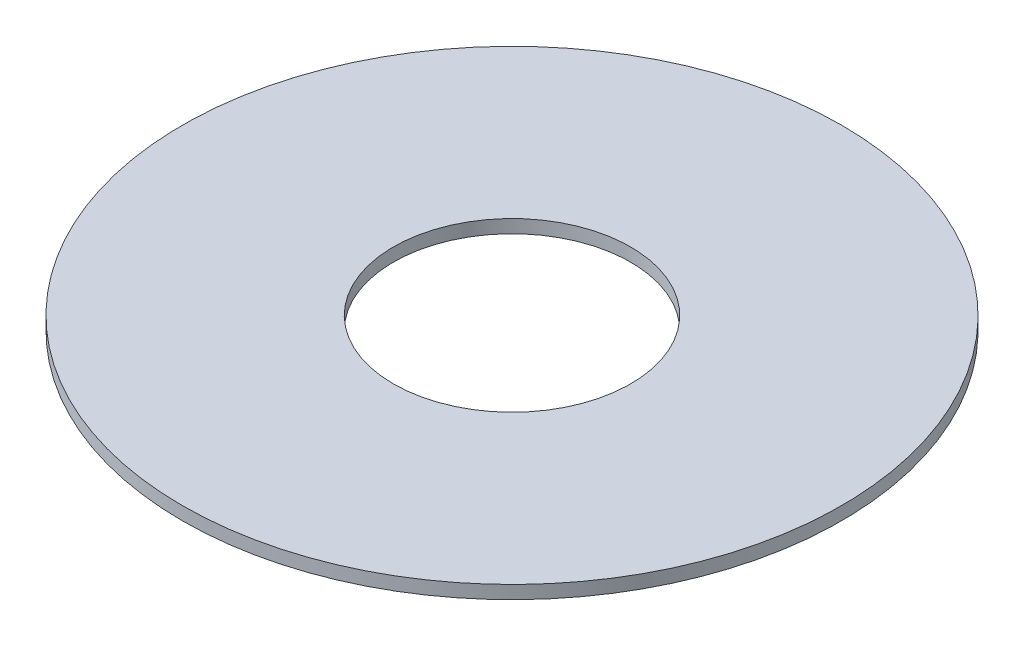
ISO-10303-21;
HEADER;
FILE_DESCRIPTION(('STEP AP214'),'2;1');
FILE_NAME('part.step','',(''),(''),'','','');
FILE_SCHEMA(('AUTOMOTIVE_DESIGN { 1 0 10303 214 1 1 1 1 }'));
ENDSEC;
DATA;
#1=APPLICATION_CONTEXT('core data for automotive mechanical design processes');
#2=APPLICATION_PROTOCOL_DEFINITION('international standard','automotive_design',2000,#1);
#3=PRODUCT_CONTEXT('',#1,'mechanical');
#4=PRODUCT('Part','Part','',(#3));
#5=PRODUCT_RELATED_PRODUCT_CATEGORY('part','',(#4));
#6=PRODUCT_DEFINITION_FORMATION('','',#4);
#7=PRODUCT_DEFINITION_CONTEXT('part definition',#1,'design');
#8=PRODUCT_DEFINITION('design','',#6,#7);
#9=PRODUCT_DEFINITION_SHAPE('','',#8);
#10=(LENGTH_UNIT() NAMED_UNIT(*) SI_UNIT(.MILLI.,.METRE.));
#11=(NAMED_UNIT(*) PLANE_ANGLE_UNIT() SI_UNIT($,.RADIAN.));
#12=(NAMED_UNIT(*) SI_UNIT($,.STERADIAN.) SOLID_ANGLE_UNIT());
#13=UNCERTAINTY_MEASURE_WITH_UNIT(LENGTH_MEASURE(1.E-05),#10,'distance_accuracy_value','');
#14=(GEOMETRIC_REPRESENTATION_CONTEXT(3) GLOBAL_UNCERTAINTY_ASSIGNED_CONTEXT((#13)) GLOBAL_UNIT_ASSIGNED_CONTEXT((#10,
#11,#12)) REPRESENTATION_CONTEXT('',''));
#15=CARTESIAN_POINT('',(0.,0.,0.));
#16=DIRECTION('',(0.,0.,1.));
#17=DIRECTION('',(1.,0.,0.));
#18=AXIS2_PLACEMENT_3D('',#15,#16,#17);
#19=CARTESIAN_POINT('',(0.,1.,0.));
#20=DIRECTION('',(0.,1.,0.));
#21=DIRECTION('',(0.,0.,1.));
#22=AXIS2_PLACEMENT_3D('',#19,#20,#21);
#23=PLANE('',#22);
#24=CARTESIAN_POINT('',(0.,1.,0.));
#25=DIRECTION('',(0.,1.,0.));
#26=DIRECTION('',(0.,0.,1.));
#27=AXIS2_PLACEMENT_3D('',#24,#25,#26);
#28=CIRCLE('',#27,25.);
#29=CARTESIAN_POINT('',(0.,1.,25.));
#30=VERTEX_POINT('',#29);
#31=EDGE_CURVE('E10',#30,#30,#28,.T.);
#32=ORIENTED_EDGE('',*,*,#31,.T.);
#33=EDGE_LOOP('',(#32));
#34=FACE_BOUND('',#33,.T.);
#35=CARTESIAN_POINT('',(0.,1.,0.));
#36=DIRECTION('',(0.,1.,0.));
#37=DIRECTION('',(0.,0.,1.));
#38=AXIS2_PLACEMENT_3D('',#35,#36,#37);
#39=CIRCLE('',#38,9.);
#40=CARTESIAN_POINT('',(0.,1.,9.));
#41=VERTEX_POINT('',#40);
#42=EDGE_CURVE('E41',#41,#41,#39,.T.);
#43=ORIENTED_EDGE('',*,*,#42,.F.);
#44=EDGE_LOOP('',(#43));
#45=FACE_BOUND('',#44,.T.);
#46=ADVANCED_FACE('F30',(#34,#45),#23,.T.);
#47=CARTESIAN_POINT('',(0.,0.,0.));
#48=DIRECTION('',(0.,1.,0.));
#49=DIRECTION('',(0.,0.,1.));
#50=AXIS2_PLACEMENT_3D('',#47,#48,#49);
#51=PLANE('',#50);
#52=CARTESIAN_POINT('',(0.,0.,0.));
#53=DIRECTION('',(0.,1.,0.));
#54=DIRECTION('',(0.,0.,1.));
#55=AXIS2_PLACEMENT_3D('',#52,#53,#54);
#56=CIRCLE('',#55,25.);
#57=CARTESIAN_POINT('',(0.,0.,25.));
#58=VERTEX_POINT('',#57);
#59=EDGE_CURVE('E34',#58,#58,#56,.T.);
#60=ORIENTED_EDGE('',*,*,#59,.F.);
#61=EDGE_LOOP('',(#60));
#62=FACE_BOUND('',#61,.T.);
#63=CARTESIAN_POINT('',(0.,0.,0.));
#64=DIRECTION('',(0.,1.,0.));
#65=DIRECTION('',(0.,0.,1.));
#66=AXIS2_PLACEMENT_3D('',#63,#64,#65);
#67=CIRCLE('',#66,9.);
#68=CARTESIAN_POINT('',(0.,0.,9.));
#69=VERTEX_POINT('',#68);
#70=EDGE_CURVE('E43',#69,#69,#67,.T.);
#71=ORIENTED_EDGE('',*,*,#70,.T.);
#72=EDGE_LOOP('',(#71));
#73=FACE_BOUND('',#72,.T.);
#74=ADVANCED_FACE('F53',(#62,#73),#51,.F.);
#75=CARTESIAN_POINT('',(0.,1.,0.));
#76=DIRECTION('',(0.,-1.,0.));
#77=DIRECTION('',(0.,0.,-1.));
#78=AXIS2_PLACEMENT_3D('',#75,#76,#77);
#79=CYLINDRICAL_SURFACE('',#78,25.);
#80=ORIENTED_EDGE('',*,*,#31,.F.);
#81=EDGE_LOOP('',(#80));
#82=FACE_BOUND('',#81,.T.);
#83=ORIENTED_EDGE('',*,*,#59,.T.);
#84=EDGE_LOOP('',(#83));
#85=FACE_BOUND('',#84,.T.);
#86=ADVANCED_FACE('F32',(#82,#85),#79,.T.);
#87=CARTESIAN_POINT('',(0.,1.,0.));
#88=DIRECTION('',(0.,-1.,0.));
#89=DIRECTION('',(0.,0.,-1.));
#90=AXIS2_PLACEMENT_3D('',#87,#88,#89);
#91=CYLINDRICAL_SURFACE('',#90,9.);
#92=ORIENTED_EDGE('',*,*,#42,.T.);
#93=EDGE_LOOP('',(#92));
#94=FACE_BOUND('',#93,.T.);
#95=ORIENTED_EDGE('',*,*,#70,.F.);
#96=EDGE_LOOP('',(#95));
#97=FACE_BOUND('',#96,.T.);
#98=ADVANCED_FACE('F49',(#94,#97),#91,.F.);
#99=CLOSED_SHELL('',(#46,#74,#86,#98));
#100=MANIFOLD_SOLID_BREP('B2',#99);
#101=ADVANCED_BREP_SHAPE_REPRESENTATION('',(#18,#100),#14);
#102=SHAPE_DEFINITION_REPRESENTATION(#9,#101);
ENDSEC;
END-ISO-10303-21;
